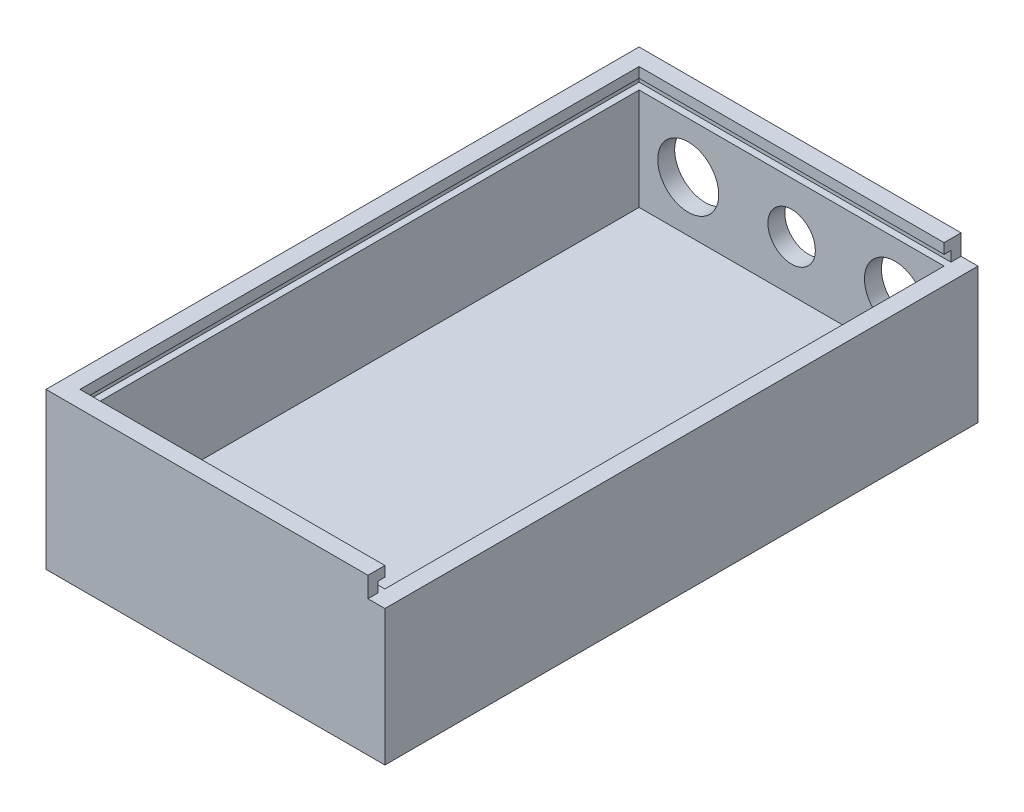
ISO-10303-21;
HEADER;
FILE_DESCRIPTION(('STEP AP214'),'2;1');
FILE_NAME('part.step','',(''),(''),'','','');
FILE_SCHEMA(('AUTOMOTIVE_DESIGN { 1 0 10303 214 1 1 1 1 }'));
ENDSEC;
DATA;
#1=APPLICATION_CONTEXT('core data for automotive mechanical design processes');
#2=APPLICATION_PROTOCOL_DEFINITION('international standard','automotive_design',2000,#1);
#3=PRODUCT_CONTEXT('',#1,'mechanical');
#4=PRODUCT('Part','Part','',(#3));
#5=PRODUCT_RELATED_PRODUCT_CATEGORY('part','',(#4));
#6=PRODUCT_DEFINITION_FORMATION('','',#4);
#7=PRODUCT_DEFINITION_CONTEXT('part definition',#1,'design');
#8=PRODUCT_DEFINITION('design','',#6,#7);
#9=PRODUCT_DEFINITION_SHAPE('','',#8);
#10=(LENGTH_UNIT() NAMED_UNIT(*) SI_UNIT(.MILLI.,.METRE.));
#11=(NAMED_UNIT(*) PLANE_ANGLE_UNIT() SI_UNIT($,.RADIAN.));
#12=(NAMED_UNIT(*) SI_UNIT($,.STERADIAN.) SOLID_ANGLE_UNIT());
#13=UNCERTAINTY_MEASURE_WITH_UNIT(LENGTH_MEASURE(1.E-05),#10,'distance_accuracy_value','');
#14=(GEOMETRIC_REPRESENTATION_CONTEXT(3) GLOBAL_UNCERTAINTY_ASSIGNED_CONTEXT((#13)) GLOBAL_UNIT_ASSIGNED_CONTEXT((#10,
#11,#12)) REPRESENTATION_CONTEXT('',''));
#15=CARTESIAN_POINT('',(0.,0.,0.));
#16=DIRECTION('',(0.,0.,1.));
#17=DIRECTION('',(1.,0.,0.));
#18=AXIS2_PLACEMENT_3D('',#15,#16,#17);
#19=CARTESIAN_POINT('',(-38.7475149105367,-16.6699801192843,170.));
#20=DIRECTION('',(1.,0.,0.));
#21=DIRECTION('',(0.,0.,-1.));
#22=AXIS2_PLACEMENT_3D('',#19,#20,#21);
#23=PLANE('',#22);
#24=DIRECTION('',(0.,0.,1.));
#25=VECTOR('',#24,1.);
#26=CARTESIAN_POINT('',(-38.7475149105367,16.3300198807157,170.));
#27=LINE('',#26,#25);
#28=CARTESIAN_POINT('',(-38.7475149105367,16.3300198807157,4.99999999999984));
#29=VERTEX_POINT('',#28);
#30=CARTESIAN_POINT('',(-38.7475149105367,16.3300198807157,170.));
#31=VERTEX_POINT('',#30);
#32=EDGE_CURVE('E172',#29,#31,#27,.T.);
#33=ORIENTED_EDGE('',*,*,#32,.F.);
#34=DIRECTION('',(0.,1.,0.));
#35=VECTOR('',#34,1.);
#36=CARTESIAN_POINT('',(-38.7475149105367,-16.6699801192843,4.99999999999997));
#37=LINE('',#36,#35);
#38=CARTESIAN_POINT('',(-38.7475149105367,19.3300198807157,4.99999999999998));
#39=VERTEX_POINT('',#38);
#40=EDGE_CURVE('E240',#29,#39,#37,.T.);
#41=ORIENTED_EDGE('',*,*,#40,.T.);
#42=DIRECTION('',(0.,0.,-1.));
#43=VECTOR('',#42,1.);
#44=CARTESIAN_POINT('',(-38.7475149105367,19.3300198807157,4.99999999999998));
#45=LINE('',#44,#43);
#46=CARTESIAN_POINT('',(-38.7475149105367,19.3300198807157,170.));
#47=VERTEX_POINT('',#46);
#48=EDGE_CURVE('E269',#47,#39,#45,.T.);
#49=ORIENTED_EDGE('',*,*,#48,.F.);
#50=DIRECTION('',(0.,1.,0.));
#51=VECTOR('',#50,1.);
#52=CARTESIAN_POINT('',(-38.7475149105367,-16.6699801192843,170.));
#53=LINE('',#52,#51);
#54=EDGE_CURVE('E189',#31,#47,#53,.T.);
#55=ORIENTED_EDGE('',*,*,#54,.F.);
#56=EDGE_LOOP('',(#33,#41,#49,#55));
#57=FACE_BOUND('',#56,.T.);
#58=ADVANCED_FACE('F36',(#57),#23,.T.);
#59=CARTESIAN_POINT('',(-38.7475149105367,-16.6699801192843,4.99999999999997));
#60=DIRECTION('',(0.,0.,1.));
#61=DIRECTION('',(1.,0.,0.));
#62=AXIS2_PLACEMENT_3D('',#59,#60,#61);
#63=PLANE('',#62);
#64=DIRECTION('',(1.,0.,0.));
#65=VECTOR('',#64,1.);
#66=CARTESIAN_POINT('',(-40.7475149105368,16.3300198807157,4.99999999999984));
#67=LINE('',#66,#65);
#68=CARTESIAN_POINT('',(51.2524850894632,16.3300198807157,4.99999999999997));
#69=VERTEX_POINT('',#68);
#70=EDGE_CURVE('E298',#29,#69,#67,.T.);
#71=ORIENTED_EDGE('',*,*,#70,.T.);
#72=DIRECTION('',(0.,-1.,0.));
#73=VECTOR('',#72,1.);
#74=CARTESIAN_POINT('',(51.2524850894632,19.3300198807157,4.99999999999997));
#75=LINE('',#74,#73);
#76=CARTESIAN_POINT('',(51.2524850894632,19.3300198807157,4.99999999999997));
#77=VERTEX_POINT('',#76);
#78=EDGE_CURVE('E261',#77,#69,#75,.T.);
#79=ORIENTED_EDGE('',*,*,#78,.F.);
#80=DIRECTION('',(1.,0.,0.));
#81=VECTOR('',#80,1.);
#82=CARTESIAN_POINT('',(51.2524850894632,19.3300198807157,4.99999999999997));
#83=LINE('',#82,#81);
#84=EDGE_CURVE('E264',#39,#77,#83,.T.);
#85=ORIENTED_EDGE('',*,*,#84,.F.);
#86=ORIENTED_EDGE('',*,*,#40,.F.);
#87=EDGE_LOOP('',(#71,#79,#85,#86));
#88=FACE_BOUND('',#87,.T.);
#89=ADVANCED_FACE('F336',(#88),#63,.T.);
#90=CARTESIAN_POINT('',(-38.7475149105367,-16.6699801192843,170.));
#91=DIRECTION('',(0.,0.,1.));
#92=DIRECTION('',(1.,0.,0.));
#93=AXIS2_PLACEMENT_3D('',#90,#91,#92);
#94=PLANE('',#93);
#95=CARTESIAN_POINT('',(-38.7475149105367,-16.6699801192843,170.));
#96=VERTEX_POINT('',#95);
#97=CARTESIAN_POINT('',(-38.7475149105367,13.3300198807157,170.));
#98=VERTEX_POINT('',#97);
#99=EDGE_CURVE('E166',#96,#98,#53,.T.);
#100=ORIENTED_EDGE('',*,*,#99,.T.);
#101=DIRECTION('',(1.,0.,0.));
#102=VECTOR('',#101,1.);
#103=CARTESIAN_POINT('',(-40.7475149105358,13.3300198807157,170.));
#104=LINE('',#103,#102);
#105=CARTESIAN_POINT('',(51.2524850894642,13.3300198807157,170.));
#106=VERTEX_POINT('',#105);
#107=EDGE_CURVE('E175',#98,#106,#104,.T.);
#108=ORIENTED_EDGE('',*,*,#107,.T.);
#109=DIRECTION('',(0.,1.,0.));
#110=VECTOR('',#109,1.);
#111=CARTESIAN_POINT('',(51.2524850894632,-16.6699801192843,170.));
#112=LINE('',#111,#110);
#113=CARTESIAN_POINT('',(51.2524850894632,-16.6699801192843,170.));
#114=VERTEX_POINT('',#113);
#115=EDGE_CURVE('E188',#114,#106,#112,.T.);
#116=ORIENTED_EDGE('',*,*,#115,.F.);
#117=DIRECTION('',(1.,0.,0.));
#118=VECTOR('',#117,1.);
#119=CARTESIAN_POINT('',(-38.7475149105367,-16.6699801192843,170.));
#120=LINE('',#119,#118);
#121=EDGE_CURVE('E187',#96,#114,#120,.T.);
#122=ORIENTED_EDGE('',*,*,#121,.F.);
#123=EDGE_LOOP('',(#100,#108,#116,#122));
#124=FACE_BOUND('',#123,.T.);
#125=ADVANCED_FACE('F185',(#124),#94,.F.);
#126=CARTESIAN_POINT('',(-43.7475149105368,13.3300198807157,175.));
#127=DIRECTION('',(0.,1.,0.));
#128=DIRECTION('',(0.,0.,1.));
#129=AXIS2_PLACEMENT_3D('',#126,#127,#128);
#130=PLANE('',#129);
#131=ORIENTED_EDGE('',*,*,#107,.F.);
#132=DIRECTION('',(0.,0.,-1.));
#133=VECTOR('',#132,1.);
#134=CARTESIAN_POINT('',(-38.7475149105367,13.3300198807157,170.));
#135=LINE('',#134,#133);
#136=CARTESIAN_POINT('',(-38.7475149105367,13.3300198807157,4.99999999999984));
#137=VERTEX_POINT('',#136);
#138=EDGE_CURVE('E162',#98,#137,#135,.T.);
#139=ORIENTED_EDGE('',*,*,#138,.T.);
#140=DIRECTION('',(1.,0.,0.));
#141=VECTOR('',#140,1.);
#142=CARTESIAN_POINT('',(-40.7475149105368,13.3300198807157,4.99999999999984));
#143=LINE('',#142,#141);
#144=CARTESIAN_POINT('',(51.2524850894632,13.3300198807157,4.99999999999997));
#145=VERTEX_POINT('',#144);
#146=EDGE_CURVE('E305',#137,#145,#143,.T.);
#147=ORIENTED_EDGE('',*,*,#146,.T.);
#148=DIRECTION('',(0.,0.,-1.));
#149=VECTOR('',#148,1.);
#150=CARTESIAN_POINT('',(51.2524850894632,13.3300198807157,170.));
#151=LINE('',#150,#149);
#152=EDGE_CURVE('E178',#106,#145,#151,.T.);
#153=ORIENTED_EDGE('',*,*,#152,.F.);
#154=EDGE_LOOP('',(#131,#139,#147,#153));
#155=FACE_BOUND('',#154,.T.);
#156=DIRECTION('',(0.,0.,-1.));
#157=VECTOR('',#156,1.);
#158=CARTESIAN_POINT('',(51.2524850894633,13.3300198807157,0.));
#159=LINE('',#158,#157);
#160=CARTESIAN_POINT('',(51.2524850894632,13.3300198807157,2.99999999999997));
#161=VERTEX_POINT('',#160);
#162=CARTESIAN_POINT('',(51.2524850894633,13.3300198807157,0.));
#163=VERTEX_POINT('',#162);
#164=EDGE_CURVE('E181',#161,#163,#159,.T.);
#165=ORIENTED_EDGE('',*,*,#164,.F.);
#166=DIRECTION('',(1.,0.,0.));
#167=VECTOR('',#166,1.);
#168=CARTESIAN_POINT('',(-40.7475149105368,13.3300198807157,2.99999999999984));
#169=LINE('',#168,#167);
#170=CARTESIAN_POINT('',(-40.7475149105368,13.3300198807157,2.99999999999984));
#171=VERTEX_POINT('',#170);
#172=EDGE_CURVE('E307',#171,#161,#169,.T.);
#173=ORIENTED_EDGE('',*,*,#172,.F.);
#174=DIRECTION('',(0.,0.,-1.));
#175=VECTOR('',#174,1.);
#176=CARTESIAN_POINT('',(-40.7475149105358,13.3300198807157,170.));
#177=LINE('',#176,#175);
#178=CARTESIAN_POINT('',(-40.7475149105358,13.3300198807157,172.));
#179=VERTEX_POINT('',#178);
#180=EDGE_CURVE('E289',#179,#171,#177,.T.);
#181=ORIENTED_EDGE('',*,*,#180,.F.);
#182=DIRECTION('',(1.,0.,0.));
#183=VECTOR('',#182,1.);
#184=CARTESIAN_POINT('',(-40.7475149105358,13.3300198807157,172.));
#185=LINE('',#184,#183);
#186=CARTESIAN_POINT('',(51.2524850894642,13.3300198807157,172.));
#187=VERTEX_POINT('',#186);
#188=EDGE_CURVE('E182',#179,#187,#185,.T.);
#189=ORIENTED_EDGE('',*,*,#188,.T.);
#190=DIRECTION('',(0.,0.,-1.));
#191=VECTOR('',#190,1.);
#192=CARTESIAN_POINT('',(51.2524850894632,13.3300198807157,170.));
#193=LINE('',#192,#191);
#194=CARTESIAN_POINT('',(51.2524850894632,13.3300198807157,175.));
#195=VERTEX_POINT('',#194);
#196=EDGE_CURVE('E61',#195,#187,#193,.T.);
#197=ORIENTED_EDGE('',*,*,#196,.F.);
#198=DIRECTION('',(1.,0.,0.));
#199=VECTOR('',#198,1.);
#200=CARTESIAN_POINT('',(-43.7475149105368,13.3300198807157,175.));
#201=LINE('',#200,#199);
#202=CARTESIAN_POINT('',(56.2524850894633,13.3300198807157,175.));
#203=VERTEX_POINT('',#202);
#204=EDGE_CURVE('E205',#195,#203,#201,.T.);
#205=ORIENTED_EDGE('',*,*,#204,.T.);
#206=DIRECTION('',(0.,0.,-1.));
#207=VECTOR('',#206,1.);
#208=CARTESIAN_POINT('',(56.2524850894633,13.3300198807157,175.));
#209=LINE('',#208,#207);
#210=CARTESIAN_POINT('',(56.2524850894633,13.3300198807157,0.));
#211=VERTEX_POINT('',#210);
#212=EDGE_CURVE('E45',#203,#211,#209,.T.);
#213=ORIENTED_EDGE('',*,*,#212,.T.);
#214=DIRECTION('',(1.,0.,0.));
#215=VECTOR('',#214,1.);
#216=CARTESIAN_POINT('',(-43.7475149105368,13.3300198807157,0.));
#217=LINE('',#216,#215);
#218=EDGE_CURVE('E215',#163,#211,#217,.T.);
#219=ORIENTED_EDGE('',*,*,#218,.F.);
#220=EDGE_LOOP('',(#165,#173,#181,#189,#197,#205,#213,#219));
#221=FACE_BOUND('',#220,.T.);
#222=ADVANCED_FACE('F176',(#155,#221),#130,.T.);
#223=CARTESIAN_POINT('',(-43.7475149105368,-26.6699801192843,175.));
#224=DIRECTION('',(0.,1.,0.));
#225=DIRECTION('',(0.,0.,1.));
#226=AXIS2_PLACEMENT_3D('',#223,#224,#225);
#227=PLANE('',#226);
#228=DIRECTION('',(1.,0.,0.));
#229=VECTOR('',#228,1.);
#230=CARTESIAN_POINT('',(-43.7475149105368,-26.6699801192843,0.));
#231=LINE('',#230,#229);
#232=CARTESIAN_POINT('',(-43.7475149105368,-26.6699801192843,0.));
#233=VERTEX_POINT('',#232);
#234=CARTESIAN_POINT('',(56.2524850894633,-26.6699801192843,0.));
#235=VERTEX_POINT('',#234);
#236=EDGE_CURVE('E198',#233,#235,#231,.T.);
#237=ORIENTED_EDGE('',*,*,#236,.T.);
#238=DIRECTION('',(0.,0.,-1.));
#239=VECTOR('',#238,1.);
#240=CARTESIAN_POINT('',(56.2524850894633,-26.6699801192843,175.));
#241=LINE('',#240,#239);
#242=CARTESIAN_POINT('',(56.2524850894633,-26.6699801192843,175.));
#243=VERTEX_POINT('',#242);
#244=EDGE_CURVE('E11',#243,#235,#241,.T.);
#245=ORIENTED_EDGE('',*,*,#244,.F.);
#246=DIRECTION('',(1.,0.,0.));
#247=VECTOR('',#246,1.);
#248=CARTESIAN_POINT('',(-43.7475149105368,-26.6699801192843,175.));
#249=LINE('',#248,#247);
#250=CARTESIAN_POINT('',(-43.7475149105368,-26.6699801192843,175.));
#251=VERTEX_POINT('',#250);
#252=EDGE_CURVE('E199',#251,#243,#249,.T.);
#253=ORIENTED_EDGE('',*,*,#252,.F.);
#254=DIRECTION('',(0.,0.,-1.));
#255=VECTOR('',#254,1.);
#256=CARTESIAN_POINT('',(-43.7475149105368,-26.6699801192843,175.));
#257=LINE('',#256,#255);
#258=EDGE_CURVE('E209',#251,#233,#257,.T.);
#259=ORIENTED_EDGE('',*,*,#258,.T.);
#260=EDGE_LOOP('',(#237,#245,#253,#259));
#261=FACE_BOUND('',#260,.T.);
#262=ADVANCED_FACE('F38',(#261),#227,.F.);
#263=CARTESIAN_POINT('',(56.2524850894633,13.3300198807157,175.));
#264=DIRECTION('',(1.,0.,0.));
#265=DIRECTION('',(0.,0.,-1.));
#266=AXIS2_PLACEMENT_3D('',#263,#264,#265);
#267=PLANE('',#266);
#268=DIRECTION('',(0.,-1.,0.));
#269=VECTOR('',#268,1.);
#270=CARTESIAN_POINT('',(56.2524850894633,13.3300198807157,0.));
#271=LINE('',#270,#269);
#272=EDGE_CURVE('E212',#211,#235,#271,.T.);
#273=ORIENTED_EDGE('',*,*,#272,.F.);
#274=ORIENTED_EDGE('',*,*,#212,.F.);
#275=DIRECTION('',(0.,-1.,0.));
#276=VECTOR('',#275,1.);
#277=CARTESIAN_POINT('',(56.2524850894633,13.3300198807157,175.));
#278=LINE('',#277,#276);
#279=EDGE_CURVE('E201',#203,#243,#278,.T.);
#280=ORIENTED_EDGE('',*,*,#279,.T.);
#281=ORIENTED_EDGE('',*,*,#244,.T.);
#282=EDGE_LOOP('',(#273,#274,#280,#281));
#283=FACE_BOUND('',#282,.T.);
#284=ADVANCED_FACE('F417',(#283),#267,.T.);
#285=CARTESIAN_POINT('',(-43.7475149105368,13.3300198807157,175.));
#286=DIRECTION('',(1.,0.,0.));
#287=DIRECTION('',(0.,1.,0.));
#288=AXIS2_PLACEMENT_3D('',#285,#286,#287);
#289=PLANE('',#288);
#290=DIRECTION('',(0.,-1.,0.));
#291=VECTOR('',#290,1.);
#292=CARTESIAN_POINT('',(-43.7475149105368,13.3300198807157,0.));
#293=LINE('',#292,#291);
#294=CARTESIAN_POINT('',(-43.7475149105368,19.3300198807157,0.));
#295=VERTEX_POINT('',#294);
#296=EDGE_CURVE('E202',#295,#233,#293,.T.);
#297=ORIENTED_EDGE('',*,*,#296,.T.);
#298=ORIENTED_EDGE('',*,*,#258,.F.);
#299=DIRECTION('',(0.,-1.,0.));
#300=VECTOR('',#299,1.);
#301=CARTESIAN_POINT('',(-43.7475149105368,13.3300198807157,175.));
#302=LINE('',#301,#300);
#303=CARTESIAN_POINT('',(-43.7475149105368,19.3300198807157,175.));
#304=VERTEX_POINT('',#303);
#305=EDGE_CURVE('E207',#304,#251,#302,.T.);
#306=ORIENTED_EDGE('',*,*,#305,.F.);
#307=DIRECTION('',(0.,0.,1.));
#308=VECTOR('',#307,1.);
#309=CARTESIAN_POINT('',(-43.7475149105368,19.3300198807157,175.));
#310=LINE('',#309,#308);
#311=EDGE_CURVE('E279',#295,#304,#310,.T.);
#312=ORIENTED_EDGE('',*,*,#311,.F.);
#313=EDGE_LOOP('',(#297,#298,#306,#312));
#314=FACE_BOUND('',#313,.T.);
#315=ADVANCED_FACE('F346',(#314),#289,.F.);
#316=CARTESIAN_POINT('',(0.,0.,175.));
#317=DIRECTION('',(0.,0.,-1.));
#318=DIRECTION('',(-1.,0.,0.));
#319=AXIS2_PLACEMENT_3D('',#316,#317,#318);
#320=PLANE('',#319);
#321=ORIENTED_EDGE('',*,*,#252,.T.);
#322=ORIENTED_EDGE('',*,*,#279,.F.);
#323=ORIENTED_EDGE('',*,*,#204,.F.);
#324=DIRECTION('',(0.,-1.,0.));
#325=VECTOR('',#324,1.);
#326=CARTESIAN_POINT('',(51.2524850894632,19.3300198807157,175.));
#327=LINE('',#326,#325);
#328=CARTESIAN_POINT('',(51.2524850894632,19.3300198807157,175.));
#329=VERTEX_POINT('',#328);
#330=EDGE_CURVE('E255',#329,#195,#327,.T.);
#331=ORIENTED_EDGE('',*,*,#330,.F.);
#332=DIRECTION('',(1.,0.,0.));
#333=VECTOR('',#332,1.);
#334=CARTESIAN_POINT('',(51.2524850894632,19.3300198807157,175.));
#335=LINE('',#334,#333);
#336=EDGE_CURVE('E277',#304,#329,#335,.T.);
#337=ORIENTED_EDGE('',*,*,#336,.F.);
#338=ORIENTED_EDGE('',*,*,#305,.T.);
#339=EDGE_LOOP('',(#321,#322,#323,#331,#337,#338));
#340=FACE_BOUND('',#339,.T.);
#341=ADVANCED_FACE('F350',(#340),#320,.F.);
#342=CARTESIAN_POINT('',(0.,0.,0.));
#343=DIRECTION('',(0.,0.,-1.));
#344=DIRECTION('',(-1.,0.,0.));
#345=AXIS2_PLACEMENT_3D('',#342,#343,#344);
#346=PLANE('',#345);
#347=CARTESIAN_POINT('',(36.7524850894632,-1.66998011928419,0.));
#348=DIRECTION('',(0.,0.,1.));
#349=DIRECTION('',(1.,0.,0.));
#350=AXIS2_PLACEMENT_3D('',#347,#348,#349);
#351=CIRCLE('',#350,9.);
#352=CARTESIAN_POINT('',(45.7524850894632,-1.66998011928419,0.));
#353=VERTEX_POINT('',#352);
#354=EDGE_CURVE('E247',#353,#353,#351,.T.);
#355=ORIENTED_EDGE('',*,*,#354,.T.);
#356=EDGE_LOOP('',(#355));
#357=FACE_BOUND('',#356,.T.);
#358=CARTESIAN_POINT('',(-24.2475149105368,-1.66998011928419,0.));
#359=DIRECTION('',(0.,0.,1.));
#360=DIRECTION('',(1.,0.,0.));
#361=AXIS2_PLACEMENT_3D('',#358,#359,#360);
#362=CIRCLE('',#361,9.);
#363=CARTESIAN_POINT('',(-15.2475149105368,-1.66998011928419,0.));
#364=VERTEX_POINT('',#363);
#365=EDGE_CURVE('E246',#364,#364,#362,.T.);
#366=ORIENTED_EDGE('',*,*,#365,.T.);
#367=EDGE_LOOP('',(#366));
#368=FACE_BOUND('',#367,.T.);
#369=CARTESIAN_POINT('',(6.25248508946324,-1.66998011928431,0.));
#370=DIRECTION('',(0.,0.,1.));
#371=DIRECTION('',(1.,0.,0.));
#372=AXIS2_PLACEMENT_3D('',#369,#370,#371);
#373=CIRCLE('',#372,7.);
#374=CARTESIAN_POINT('',(13.2524850894632,-1.66998011928431,0.));
#375=VERTEX_POINT('',#374);
#376=EDGE_CURVE('E225',#375,#375,#373,.T.);
#377=ORIENTED_EDGE('',*,*,#376,.T.);
#378=EDGE_LOOP('',(#377));
#379=FACE_BOUND('',#378,.T.);
#380=ORIENTED_EDGE('',*,*,#236,.F.);
#381=ORIENTED_EDGE('',*,*,#296,.F.);
#382=DIRECTION('',(-1.,0.,0.));
#383=VECTOR('',#382,1.);
#384=CARTESIAN_POINT('',(-43.7475149105368,19.3300198807157,0.));
#385=LINE('',#384,#383);
#386=CARTESIAN_POINT('',(51.2524850894633,19.3300198807157,0.));
#387=VERTEX_POINT('',#386);
#388=EDGE_CURVE('E282',#387,#295,#385,.T.);
#389=ORIENTED_EDGE('',*,*,#388,.F.);
#390=DIRECTION('',(0.,-1.,0.));
#391=VECTOR('',#390,1.);
#392=CARTESIAN_POINT('',(51.2524850894633,19.3300198807157,0.));
#393=LINE('',#392,#391);
#394=EDGE_CURVE('E250',#387,#163,#393,.T.);
#395=ORIENTED_EDGE('',*,*,#394,.T.);
#396=ORIENTED_EDGE('',*,*,#218,.T.);
#397=ORIENTED_EDGE('',*,*,#272,.T.);
#398=EDGE_LOOP('',(#380,#381,#389,#395,#396,#397));
#399=FACE_BOUND('',#398,.T.);
#400=ADVANCED_FACE('F375',(#357,#368,#379,#399),#346,.T.);
#401=ORIENTED_EDGE('',*,*,#146,.F.);
#402=CARTESIAN_POINT('',(-38.7475149105367,-16.6699801192843,4.99999999999997));
#403=VERTEX_POINT('',#402);
#404=EDGE_CURVE('E169',#403,#137,#37,.T.);
#405=ORIENTED_EDGE('',*,*,#404,.F.);
#406=DIRECTION('',(1.,0.,0.));
#407=VECTOR('',#406,1.);
#408=CARTESIAN_POINT('',(-38.7475149105367,-16.6699801192843,4.99999999999997));
#409=LINE('',#408,#407);
#410=CARTESIAN_POINT('',(51.2524850894632,-16.6699801192843,4.99999999999997));
#411=VERTEX_POINT('',#410);
#412=EDGE_CURVE('E232',#403,#411,#409,.T.);
#413=ORIENTED_EDGE('',*,*,#412,.T.);
#414=DIRECTION('',(0.,1.,0.));
#415=VECTOR('',#414,1.);
#416=CARTESIAN_POINT('',(51.2524850894632,-16.6699801192843,4.99999999999997));
#417=LINE('',#416,#415);
#418=EDGE_CURVE('E191',#411,#145,#417,.T.);
#419=ORIENTED_EDGE('',*,*,#418,.T.);
#420=EDGE_LOOP('',(#401,#405,#413,#419));
#421=FACE_BOUND('',#420,.T.);
#422=CARTESIAN_POINT('',(36.7524850894632,-1.66998011928419,4.99999999999997));
#423=DIRECTION('',(0.,0.,1.));
#424=DIRECTION('',(1.,0.,0.));
#425=AXIS2_PLACEMENT_3D('',#422,#423,#424);
#426=CIRCLE('',#425,9.);
#427=CARTESIAN_POINT('',(45.7524850894632,-1.66998011928419,4.99999999999997));
#428=VERTEX_POINT('',#427);
#429=EDGE_CURVE('E40',#428,#428,#426,.F.);
#430=ORIENTED_EDGE('',*,*,#429,.T.);
#431=EDGE_LOOP('',(#430));
#432=FACE_BOUND('',#431,.T.);
#433=CARTESIAN_POINT('',(-24.2475149105368,-1.66998011928419,4.99999999999997));
#434=DIRECTION('',(0.,0.,1.));
#435=DIRECTION('',(1.,0.,0.));
#436=AXIS2_PLACEMENT_3D('',#433,#434,#435);
#437=CIRCLE('',#436,9.);
#438=CARTESIAN_POINT('',(-15.2475149105368,-1.66998011928419,4.99999999999997));
#439=VERTEX_POINT('',#438);
#440=EDGE_CURVE('E224',#439,#439,#437,.F.);
#441=ORIENTED_EDGE('',*,*,#440,.T.);
#442=EDGE_LOOP('',(#441));
#443=FACE_BOUND('',#442,.T.);
#444=CARTESIAN_POINT('',(6.25248508946324,-1.66998011928431,4.99999999999997));
#445=DIRECTION('',(0.,0.,1.));
#446=DIRECTION('',(1.,0.,0.));
#447=AXIS2_PLACEMENT_3D('',#444,#445,#446);
#448=CIRCLE('',#447,7.);
#449=CARTESIAN_POINT('',(13.2524850894632,-1.66998011928431,4.99999999999997));
#450=VERTEX_POINT('',#449);
#451=EDGE_CURVE('E222',#450,#450,#448,.F.);
#452=ORIENTED_EDGE('',*,*,#451,.T.);
#453=EDGE_LOOP('',(#452));
#454=FACE_BOUND('',#453,.T.);
#455=ADVANCED_FACE('F377',(#421,#432,#443,#454),#63,.T.);
#456=CARTESIAN_POINT('',(51.2524850894632,-16.6699801192843,170.));
#457=DIRECTION('',(1.,0.,0.));
#458=DIRECTION('',(0.,0.,-1.));
#459=AXIS2_PLACEMENT_3D('',#456,#457,#458);
#460=PLANE('',#459);
#461=ORIENTED_EDGE('',*,*,#152,.T.);
#462=ORIENTED_EDGE('',*,*,#418,.F.);
#463=DIRECTION('',(0.,0.,-1.));
#464=VECTOR('',#463,1.);
#465=CARTESIAN_POINT('',(51.2524850894632,-16.6699801192843,170.));
#466=LINE('',#465,#464);
#467=EDGE_CURVE('E235',#114,#411,#466,.T.);
#468=ORIENTED_EDGE('',*,*,#467,.F.);
#469=ORIENTED_EDGE('',*,*,#115,.T.);
#470=EDGE_LOOP('',(#461,#462,#468,#469));
#471=FACE_BOUND('',#470,.T.);
#472=ADVANCED_FACE('F384',(#471),#460,.F.);
#473=DIRECTION('',(0.,-1.,0.));
#474=VECTOR('',#473,1.);
#475=CARTESIAN_POINT('',(51.2524850894632,19.3300198807157,170.));
#476=LINE('',#475,#474);
#477=CARTESIAN_POINT('',(51.2524850894632,19.3300198807157,170.));
#478=VERTEX_POINT('',#477);
#479=CARTESIAN_POINT('',(51.2524850894632,16.3300198807157,170.));
#480=VERTEX_POINT('',#479);
#481=EDGE_CURVE('E258',#478,#480,#476,.T.);
#482=ORIENTED_EDGE('',*,*,#481,.T.);
#483=DIRECTION('',(1.,0.,0.));
#484=VECTOR('',#483,1.);
#485=CARTESIAN_POINT('',(-40.7475149105358,16.3300198807157,170.));
#486=LINE('',#485,#484);
#487=EDGE_CURVE('E53',#31,#480,#486,.T.);
#488=ORIENTED_EDGE('',*,*,#487,.F.);
#489=ORIENTED_EDGE('',*,*,#54,.T.);
#490=DIRECTION('',(-1.,0.,0.));
#491=VECTOR('',#490,1.);
#492=CARTESIAN_POINT('',(-38.7475149105367,19.3300198807157,170.));
#493=LINE('',#492,#491);
#494=EDGE_CURVE('E272',#478,#47,#493,.T.);
#495=ORIENTED_EDGE('',*,*,#494,.F.);
#496=EDGE_LOOP('',(#482,#488,#489,#495));
#497=FACE_BOUND('',#496,.T.);
#498=ADVANCED_FACE('F327',(#497),#94,.F.);
#499=ORIENTED_EDGE('',*,*,#138,.F.);
#500=ORIENTED_EDGE('',*,*,#99,.F.);
#501=DIRECTION('',(0.,0.,-1.));
#502=VECTOR('',#501,1.);
#503=CARTESIAN_POINT('',(-38.7475149105367,-16.6699801192843,170.));
#504=LINE('',#503,#502);
#505=EDGE_CURVE('E238',#96,#403,#504,.T.);
#506=ORIENTED_EDGE('',*,*,#505,.T.);
#507=ORIENTED_EDGE('',*,*,#404,.T.);
#508=EDGE_LOOP('',(#499,#500,#506,#507));
#509=FACE_BOUND('',#508,.T.);
#510=ADVANCED_FACE('F164',(#509),#23,.T.);
#511=CARTESIAN_POINT('',(0.,-16.6699801192843,0.));
#512=DIRECTION('',(0.,1.,0.));
#513=DIRECTION('',(0.,0.,1.));
#514=AXIS2_PLACEMENT_3D('',#511,#512,#513);
#515=PLANE('',#514);
#516=ORIENTED_EDGE('',*,*,#412,.F.);
#517=ORIENTED_EDGE('',*,*,#505,.F.);
#518=ORIENTED_EDGE('',*,*,#121,.T.);
#519=ORIENTED_EDGE('',*,*,#467,.T.);
#520=EDGE_LOOP('',(#516,#517,#518,#519));
#521=FACE_BOUND('',#520,.T.);
#522=ADVANCED_FACE('F398',(#521),#515,.T.);
#523=CARTESIAN_POINT('',(6.25248508946324,-1.66998011928431,10.));
#524=DIRECTION('',(0.,0.,-1.));
#525=DIRECTION('',(-1.,0.,0.));
#526=AXIS2_PLACEMENT_3D('',#523,#524,#525);
#527=CYLINDRICAL_SURFACE('',#526,7.);
#528=ORIENTED_EDGE('',*,*,#451,.F.);
#529=EDGE_LOOP('',(#528));
#530=FACE_BOUND('',#529,.T.);
#531=ORIENTED_EDGE('',*,*,#376,.F.);
#532=EDGE_LOOP('',(#531));
#533=FACE_BOUND('',#532,.T.);
#534=ADVANCED_FACE('F403',(#530,#533),#527,.F.);
#535=CARTESIAN_POINT('',(-24.2475149105368,-1.66998011928419,10.));
#536=DIRECTION('',(0.,0.,-1.));
#537=DIRECTION('',(-1.,0.,0.));
#538=AXIS2_PLACEMENT_3D('',#535,#536,#537);
#539=CYLINDRICAL_SURFACE('',#538,9.);
#540=ORIENTED_EDGE('',*,*,#440,.F.);
#541=EDGE_LOOP('',(#540));
#542=FACE_BOUND('',#541,.T.);
#543=ORIENTED_EDGE('',*,*,#365,.F.);
#544=EDGE_LOOP('',(#543));
#545=FACE_BOUND('',#544,.T.);
#546=ADVANCED_FACE('F560',(#542,#545),#539,.F.);
#547=CARTESIAN_POINT('',(36.7524850894632,-1.66998011928419,10.));
#548=DIRECTION('',(0.,0.,-1.));
#549=DIRECTION('',(-1.,0.,0.));
#550=AXIS2_PLACEMENT_3D('',#547,#548,#549);
#551=CYLINDRICAL_SURFACE('',#550,9.);
#552=ORIENTED_EDGE('',*,*,#429,.F.);
#553=EDGE_LOOP('',(#552));
#554=FACE_BOUND('',#553,.T.);
#555=ORIENTED_EDGE('',*,*,#354,.F.);
#556=EDGE_LOOP('',(#555));
#557=FACE_BOUND('',#556,.T.);
#558=ADVANCED_FACE('F483',(#554,#557),#551,.F.);
#559=CARTESIAN_POINT('',(51.2524850894633,19.3300198807157,0.));
#560=DIRECTION('',(-1.,0.,0.));
#561=DIRECTION('',(0.,0.,1.));
#562=AXIS2_PLACEMENT_3D('',#559,#560,#561);
#563=PLANE('',#562);
#564=ORIENTED_EDGE('',*,*,#78,.T.);
#565=DIRECTION('',(0.,0.,1.));
#566=VECTOR('',#565,1.);
#567=CARTESIAN_POINT('',(51.2524850894632,16.3300198807157,4.99999999999997));
#568=LINE('',#567,#566);
#569=CARTESIAN_POINT('',(51.2524850894632,16.3300198807157,2.99999999999997));
#570=VERTEX_POINT('',#569);
#571=EDGE_CURVE('E314',#570,#69,#568,.T.);
#572=ORIENTED_EDGE('',*,*,#571,.F.);
#573=DIRECTION('',(0.,1.,0.));
#574=VECTOR('',#573,1.);
#575=CARTESIAN_POINT('',(51.2524850894632,13.3300198807157,2.99999999999997));
#576=LINE('',#575,#574);
#577=EDGE_CURVE('E316',#161,#570,#576,.T.);
#578=ORIENTED_EDGE('',*,*,#577,.F.);
#579=ORIENTED_EDGE('',*,*,#164,.T.);
#580=ORIENTED_EDGE('',*,*,#394,.F.);
#581=DIRECTION('',(0.,0.,-1.));
#582=VECTOR('',#581,1.);
#583=CARTESIAN_POINT('',(51.2524850894633,19.3300198807157,0.));
#584=LINE('',#583,#582);
#585=EDGE_CURVE('E266',#77,#387,#584,.T.);
#586=ORIENTED_EDGE('',*,*,#585,.F.);
#587=EDGE_LOOP('',(#564,#572,#578,#579,#580,#586));
#588=FACE_BOUND('',#587,.T.);
#589=ADVANCED_FACE('F341',(#588),#563,.F.);
#590=CARTESIAN_POINT('',(51.2524850894632,19.3300198807157,170.));
#591=DIRECTION('',(-1.,0.,0.));
#592=DIRECTION('',(0.,0.,1.));
#593=AXIS2_PLACEMENT_3D('',#590,#591,#592);
#594=PLANE('',#593);
#595=ORIENTED_EDGE('',*,*,#196,.T.);
#596=DIRECTION('',(0.,-1.,0.));
#597=VECTOR('',#596,1.);
#598=CARTESIAN_POINT('',(51.2524850894642,13.3300198807157,172.));
#599=LINE('',#598,#597);
#600=CARTESIAN_POINT('',(51.2524850894642,16.3300198807157,172.));
#601=VERTEX_POINT('',#600);
#602=EDGE_CURVE('E292',#601,#187,#599,.T.);
#603=ORIENTED_EDGE('',*,*,#602,.F.);
#604=DIRECTION('',(0.,0.,1.));
#605=VECTOR('',#604,1.);
#606=CARTESIAN_POINT('',(51.2524850894642,16.3300198807157,172.));
#607=LINE('',#606,#605);
#608=EDGE_CURVE('E296',#480,#601,#607,.T.);
#609=ORIENTED_EDGE('',*,*,#608,.F.);
#610=ORIENTED_EDGE('',*,*,#481,.F.);
#611=DIRECTION('',(0.,0.,-1.));
#612=VECTOR('',#611,1.);
#613=CARTESIAN_POINT('',(51.2524850894632,19.3300198807157,170.));
#614=LINE('',#613,#612);
#615=EDGE_CURVE('E275',#329,#478,#614,.T.);
#616=ORIENTED_EDGE('',*,*,#615,.F.);
#617=ORIENTED_EDGE('',*,*,#330,.T.);
#618=EDGE_LOOP('',(#595,#603,#609,#610,#616,#617));
#619=FACE_BOUND('',#618,.T.);
#620=ADVANCED_FACE('F356',(#619),#594,.F.);
#621=CARTESIAN_POINT('',(0.,19.3300198807157,0.));
#622=DIRECTION('',(0.,-1.,0.));
#623=DIRECTION('',(0.,0.,-1.));
#624=AXIS2_PLACEMENT_3D('',#621,#622,#623);
#625=PLANE('',#624);
#626=ORIENTED_EDGE('',*,*,#585,.T.);
#627=ORIENTED_EDGE('',*,*,#388,.T.);
#628=ORIENTED_EDGE('',*,*,#311,.T.);
#629=ORIENTED_EDGE('',*,*,#336,.T.);
#630=ORIENTED_EDGE('',*,*,#615,.T.);
#631=ORIENTED_EDGE('',*,*,#494,.T.);
#632=ORIENTED_EDGE('',*,*,#48,.T.);
#633=ORIENTED_EDGE('',*,*,#84,.T.);
#634=EDGE_LOOP('',(#626,#627,#628,#629,#630,#631,#632,#633));
#635=FACE_BOUND('',#634,.T.);
#636=ADVANCED_FACE('F333',(#635),#625,.F.);
#637=CARTESIAN_POINT('',(-40.7475149105358,13.3300198807157,172.));
#638=DIRECTION('',(0.,0.,1.));
#639=DIRECTION('',(1.,0.,0.));
#640=AXIS2_PLACEMENT_3D('',#637,#638,#639);
#641=PLANE('',#640);
#642=ORIENTED_EDGE('',*,*,#602,.T.);
#643=ORIENTED_EDGE('',*,*,#188,.F.);
#644=DIRECTION('',(0.,-1.,0.));
#645=VECTOR('',#644,1.);
#646=CARTESIAN_POINT('',(-40.7475149105358,13.3300198807157,172.));
#647=LINE('',#646,#645);
#648=CARTESIAN_POINT('',(-40.7475149105358,16.3300198807157,172.));
#649=VERTEX_POINT('',#648);
#650=EDGE_CURVE('E300',#649,#179,#647,.T.);
#651=ORIENTED_EDGE('',*,*,#650,.F.);
#652=DIRECTION('',(1.,0.,0.));
#653=VECTOR('',#652,1.);
#654=CARTESIAN_POINT('',(-40.7475149105358,16.3300198807157,172.));
#655=LINE('',#654,#653);
#656=EDGE_CURVE('E288',#649,#601,#655,.T.);
#657=ORIENTED_EDGE('',*,*,#656,.T.);
#658=EDGE_LOOP('',(#642,#643,#651,#657));
#659=FACE_BOUND('',#658,.T.);
#660=ADVANCED_FACE('F361',(#659),#641,.F.);
#661=CARTESIAN_POINT('',(-40.7475149105358,16.3300198807157,172.));
#662=DIRECTION('',(0.,1.,0.));
#663=DIRECTION('',(0.,0.,1.));
#664=AXIS2_PLACEMENT_3D('',#661,#662,#663);
#665=PLANE('',#664);
#666=ORIENTED_EDGE('',*,*,#608,.T.);
#667=ORIENTED_EDGE('',*,*,#656,.F.);
#668=DIRECTION('',(0.,0.,1.));
#669=VECTOR('',#668,1.);
#670=CARTESIAN_POINT('',(-40.7475149105358,16.3300198807157,172.));
#671=LINE('',#670,#669);
#672=CARTESIAN_POINT('',(-40.7475149105368,16.3300198807157,2.99999999999984));
#673=VERTEX_POINT('',#672);
#674=EDGE_CURVE('E295',#673,#649,#671,.T.);
#675=ORIENTED_EDGE('',*,*,#674,.F.);
#676=DIRECTION('',(1.,0.,0.));
#677=VECTOR('',#676,1.);
#678=CARTESIAN_POINT('',(-40.7475149105368,16.3300198807157,2.99999999999984));
#679=LINE('',#678,#677);
#680=EDGE_CURVE('E310',#673,#570,#679,.T.);
#681=ORIENTED_EDGE('',*,*,#680,.T.);
#682=ORIENTED_EDGE('',*,*,#571,.T.);
#683=ORIENTED_EDGE('',*,*,#70,.F.);
#684=ORIENTED_EDGE('',*,*,#32,.T.);
#685=ORIENTED_EDGE('',*,*,#487,.T.);
#686=EDGE_LOOP('',(#666,#667,#675,#681,#682,#683,#684,#685));
#687=FACE_BOUND('',#686,.T.);
#688=ADVANCED_FACE('F322',(#687),#665,.F.);
#689=CARTESIAN_POINT('',(-40.7475149105358,0.,1.27675647831893E-13));
#690=DIRECTION('',(-1.,0.,0.));
#691=DIRECTION('',(0.,0.,1.));
#692=AXIS2_PLACEMENT_3D('',#689,#690,#691);
#693=PLANE('',#692);
#694=ORIENTED_EDGE('',*,*,#180,.T.);
#695=DIRECTION('',(0.,1.,0.));
#696=VECTOR('',#695,1.);
#697=CARTESIAN_POINT('',(-40.7475149105368,13.3300198807157,2.99999999999984));
#698=LINE('',#697,#696);
#699=EDGE_CURVE('E308',#171,#673,#698,.T.);
#700=ORIENTED_EDGE('',*,*,#699,.T.);
#701=ORIENTED_EDGE('',*,*,#674,.T.);
#702=ORIENTED_EDGE('',*,*,#650,.T.);
#703=EDGE_LOOP('',(#694,#700,#701,#702));
#704=FACE_BOUND('',#703,.T.);
#705=ADVANCED_FACE('F364',(#704),#693,.F.);
#706=CARTESIAN_POINT('',(-40.7475149105368,13.3300198807157,2.99999999999984));
#707=DIRECTION('',(0.,0.,-1.));
#708=DIRECTION('',(-1.,0.,0.));
#709=AXIS2_PLACEMENT_3D('',#706,#707,#708);
#710=PLANE('',#709);
#711=ORIENTED_EDGE('',*,*,#577,.T.);
#712=ORIENTED_EDGE('',*,*,#680,.F.);
#713=ORIENTED_EDGE('',*,*,#699,.F.);
#714=ORIENTED_EDGE('',*,*,#172,.T.);
#715=EDGE_LOOP('',(#711,#712,#713,#714));
#716=FACE_BOUND('',#715,.T.);
#717=ADVANCED_FACE('F368',(#716),#710,.F.);
#718=CLOSED_SHELL('',(#58,#89,#125,#222,#262,#284,#315,#341,#400,#455,#472,#498,#510,#522,#534,
#546,#558,#589,#620,#636,#660,#688,#705,#717));
#719=MANIFOLD_SOLID_BREP('B2',#718);
#720=ADVANCED_BREP_SHAPE_REPRESENTATION('',(#18,#719),#14);
#721=SHAPE_DEFINITION_REPRESENTATION(#9,#720);
ENDSEC;
END-ISO-10303-21;
